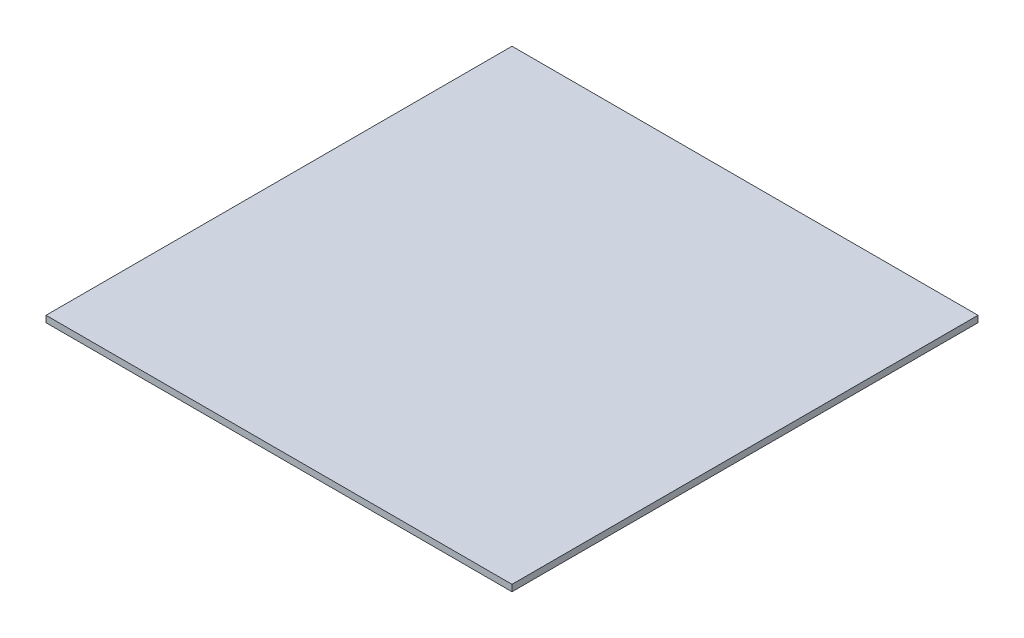
ISO-10303-21;
HEADER;
FILE_DESCRIPTION(('STEP AP214'),'2;1');
FILE_NAME('part.step','',(''),(''),'','','');
FILE_SCHEMA(('AUTOMOTIVE_DESIGN { 1 0 10303 214 1 1 1 1 }'));
ENDSEC;
DATA;
#1=APPLICATION_CONTEXT('core data for automotive mechanical design processes');
#2=APPLICATION_PROTOCOL_DEFINITION('international standard','automotive_design',2000,#1);
#3=PRODUCT_CONTEXT('',#1,'mechanical');
#4=PRODUCT('Part','Part','',(#3));
#5=PRODUCT_RELATED_PRODUCT_CATEGORY('part','',(#4));
#6=PRODUCT_DEFINITION_FORMATION('','',#4);
#7=PRODUCT_DEFINITION_CONTEXT('part definition',#1,'design');
#8=PRODUCT_DEFINITION('design','',#6,#7);
#9=PRODUCT_DEFINITION_SHAPE('','',#8);
#10=(LENGTH_UNIT() NAMED_UNIT(*) SI_UNIT(.MILLI.,.METRE.));
#11=(NAMED_UNIT(*) PLANE_ANGLE_UNIT() SI_UNIT($,.RADIAN.));
#12=(NAMED_UNIT(*) SI_UNIT($,.STERADIAN.) SOLID_ANGLE_UNIT());
#13=UNCERTAINTY_MEASURE_WITH_UNIT(LENGTH_MEASURE(1.E-05),#10,'distance_accuracy_value','');
#14=(GEOMETRIC_REPRESENTATION_CONTEXT(3) GLOBAL_UNCERTAINTY_ASSIGNED_CONTEXT((#13)) GLOBAL_UNIT_ASSIGNED_CONTEXT((#10,
#11,#12)) REPRESENTATION_CONTEXT('',''));
#15=CARTESIAN_POINT('',(0.,0.,0.));
#16=DIRECTION('',(0.,0.,1.));
#17=DIRECTION('',(1.,0.,0.));
#18=AXIS2_PLACEMENT_3D('',#15,#16,#17);
#19=CARTESIAN_POINT('',(914.4,-25.4,914.4));
#20=DIRECTION('',(1.,0.,0.));
#21=DIRECTION('',(0.,0.,-1.));
#22=AXIS2_PLACEMENT_3D('',#19,#20,#21);
#23=PLANE('',#22);
#24=DIRECTION('',(0.,0.,-1.));
#25=VECTOR('',#24,1.);
#26=CARTESIAN_POINT('',(914.4,0.,914.4));
#27=LINE('',#26,#25);
#28=CARTESIAN_POINT('',(914.4,0.,914.4));
#29=VERTEX_POINT('',#28);
#30=CARTESIAN_POINT('',(914.4,0.,-914.4));
#31=VERTEX_POINT('',#30);
#32=EDGE_CURVE('E96',#29,#31,#27,.T.);
#33=ORIENTED_EDGE('',*,*,#32,.F.);
#34=DIRECTION('',(0.,1.,0.));
#35=VECTOR('',#34,1.);
#36=CARTESIAN_POINT('',(914.4,-25.4,914.4));
#37=LINE('',#36,#35);
#38=CARTESIAN_POINT('',(914.4,-25.4,914.4));
#39=VERTEX_POINT('',#38);
#40=EDGE_CURVE('E11',#39,#29,#37,.T.);
#41=ORIENTED_EDGE('',*,*,#40,.F.);
#42=DIRECTION('',(0.,0.,-1.));
#43=VECTOR('',#42,1.);
#44=CARTESIAN_POINT('',(914.4,-25.4,914.4));
#45=LINE('',#44,#43);
#46=CARTESIAN_POINT('',(914.4,-25.4,-914.4));
#47=VERTEX_POINT('',#46);
#48=EDGE_CURVE('E90',#39,#47,#45,.T.);
#49=ORIENTED_EDGE('',*,*,#48,.T.);
#50=DIRECTION('',(0.,1.,0.));
#51=VECTOR('',#50,1.);
#52=CARTESIAN_POINT('',(914.4,-25.4,-914.4));
#53=LINE('',#52,#51);
#54=EDGE_CURVE('E35',#47,#31,#53,.T.);
#55=ORIENTED_EDGE('',*,*,#54,.T.);
#56=EDGE_LOOP('',(#33,#41,#49,#55));
#57=FACE_BOUND('',#56,.T.);
#58=ADVANCED_FACE('F32',(#57),#23,.T.);
#59=CARTESIAN_POINT('',(-914.4,-25.4,914.4));
#60=DIRECTION('',(0.,0.,1.));
#61=DIRECTION('',(1.,0.,0.));
#62=AXIS2_PLACEMENT_3D('',#59,#60,#61);
#63=PLANE('',#62);
#64=DIRECTION('',(1.,0.,0.));
#65=VECTOR('',#64,1.);
#66=CARTESIAN_POINT('',(-914.4,0.,914.4));
#67=LINE('',#66,#65);
#68=CARTESIAN_POINT('',(-914.4,0.,914.4));
#69=VERTEX_POINT('',#68);
#70=EDGE_CURVE('E92',#69,#29,#67,.T.);
#71=ORIENTED_EDGE('',*,*,#70,.F.);
#72=DIRECTION('',(0.,1.,0.));
#73=VECTOR('',#72,1.);
#74=CARTESIAN_POINT('',(-914.4,-25.4,914.4));
#75=LINE('',#74,#73);
#76=CARTESIAN_POINT('',(-914.4,-25.4,914.4));
#77=VERTEX_POINT('',#76);
#78=EDGE_CURVE('E41',#77,#69,#75,.T.);
#79=ORIENTED_EDGE('',*,*,#78,.F.);
#80=DIRECTION('',(1.,0.,0.));
#81=VECTOR('',#80,1.);
#82=CARTESIAN_POINT('',(-914.4,-25.4,914.4));
#83=LINE('',#82,#81);
#84=EDGE_CURVE('E87',#77,#39,#83,.T.);
#85=ORIENTED_EDGE('',*,*,#84,.T.);
#86=ORIENTED_EDGE('',*,*,#40,.T.);
#87=EDGE_LOOP('',(#71,#79,#85,#86));
#88=FACE_BOUND('',#87,.T.);
#89=ADVANCED_FACE('F106',(#88),#63,.T.);
#90=CARTESIAN_POINT('',(-914.4,-25.4,914.4));
#91=DIRECTION('',(-1.,0.,0.));
#92=DIRECTION('',(0.,0.,1.));
#93=AXIS2_PLACEMENT_3D('',#90,#91,#92);
#94=PLANE('',#93);
#95=DIRECTION('',(0.,0.,1.));
#96=VECTOR('',#95,1.);
#97=CARTESIAN_POINT('',(-914.4,0.,914.4));
#98=LINE('',#97,#96);
#99=CARTESIAN_POINT('',(-914.4,0.,-914.4));
#100=VERTEX_POINT('',#99);
#101=EDGE_CURVE('E82',#100,#69,#98,.T.);
#102=ORIENTED_EDGE('',*,*,#101,.F.);
#103=DIRECTION('',(0.,1.,0.));
#104=VECTOR('',#103,1.);
#105=CARTESIAN_POINT('',(-914.4,-25.4,-914.4));
#106=LINE('',#105,#104);
#107=CARTESIAN_POINT('',(-914.4,-25.4,-914.4));
#108=VERTEX_POINT('',#107);
#109=EDGE_CURVE('E77',#108,#100,#106,.T.);
#110=ORIENTED_EDGE('',*,*,#109,.F.);
#111=DIRECTION('',(0.,0.,1.));
#112=VECTOR('',#111,1.);
#113=CARTESIAN_POINT('',(-914.4,-25.4,914.4));
#114=LINE('',#113,#112);
#115=EDGE_CURVE('E80',#108,#77,#114,.T.);
#116=ORIENTED_EDGE('',*,*,#115,.T.);
#117=ORIENTED_EDGE('',*,*,#78,.T.);
#118=EDGE_LOOP('',(#102,#110,#116,#117));
#119=FACE_BOUND('',#118,.T.);
#120=ADVANCED_FACE('F79',(#119),#94,.T.);
#121=CARTESIAN_POINT('',(-914.4,-25.4,-914.4));
#122=DIRECTION('',(0.,0.,-1.));
#123=DIRECTION('',(-1.,0.,0.));
#124=AXIS2_PLACEMENT_3D('',#121,#122,#123);
#125=PLANE('',#124);
#126=DIRECTION('',(-1.,0.,0.));
#127=VECTOR('',#126,1.);
#128=CARTESIAN_POINT('',(-914.4,0.,-914.4));
#129=LINE('',#128,#127);
#130=EDGE_CURVE('E99',#31,#100,#129,.T.);
#131=ORIENTED_EDGE('',*,*,#130,.F.);
#132=ORIENTED_EDGE('',*,*,#54,.F.);
#133=DIRECTION('',(-1.,0.,0.));
#134=VECTOR('',#133,1.);
#135=CARTESIAN_POINT('',(-914.4,-25.4,-914.4));
#136=LINE('',#135,#134);
#137=EDGE_CURVE('E86',#47,#108,#136,.T.);
#138=ORIENTED_EDGE('',*,*,#137,.T.);
#139=ORIENTED_EDGE('',*,*,#109,.T.);
#140=EDGE_LOOP('',(#131,#132,#138,#139));
#141=FACE_BOUND('',#140,.T.);
#142=ADVANCED_FACE('F89',(#141),#125,.T.);
#143=CARTESIAN_POINT('',(914.4,-25.4,-914.4));
#144=DIRECTION('',(0.,-1.,0.));
#145=DIRECTION('',(0.,0.,-1.));
#146=AXIS2_PLACEMENT_3D('',#143,#144,#145);
#147=PLANE('',#146);
#148=ORIENTED_EDGE('',*,*,#48,.F.);
#149=ORIENTED_EDGE('',*,*,#84,.F.);
#150=ORIENTED_EDGE('',*,*,#115,.F.);
#151=ORIENTED_EDGE('',*,*,#137,.F.);
#152=EDGE_LOOP('',(#148,#149,#150,#151));
#153=FACE_BOUND('',#152,.T.);
#154=ADVANCED_FACE('F85',(#153),#147,.T.);
#155=CARTESIAN_POINT('',(914.4,0.,-914.4));
#156=DIRECTION('',(0.,-1.,0.));
#157=DIRECTION('',(0.,0.,-1.));
#158=AXIS2_PLACEMENT_3D('',#155,#156,#157);
#159=PLANE('',#158);
#160=ORIENTED_EDGE('',*,*,#32,.T.);
#161=ORIENTED_EDGE('',*,*,#130,.T.);
#162=ORIENTED_EDGE('',*,*,#101,.T.);
#163=ORIENTED_EDGE('',*,*,#70,.T.);
#164=EDGE_LOOP('',(#160,#161,#162,#163));
#165=FACE_BOUND('',#164,.T.);
#166=ADVANCED_FACE('F105',(#165),#159,.F.);
#167=CLOSED_SHELL('',(#58,#89,#120,#142,#154,#166));
#168=MANIFOLD_SOLID_BREP('B2',#167);
#169=ADVANCED_BREP_SHAPE_REPRESENTATION('',(#18,#168),#14);
#170=SHAPE_DEFINITION_REPRESENTATION(#9,#169);
ENDSEC;
END-ISO-10303-21;
